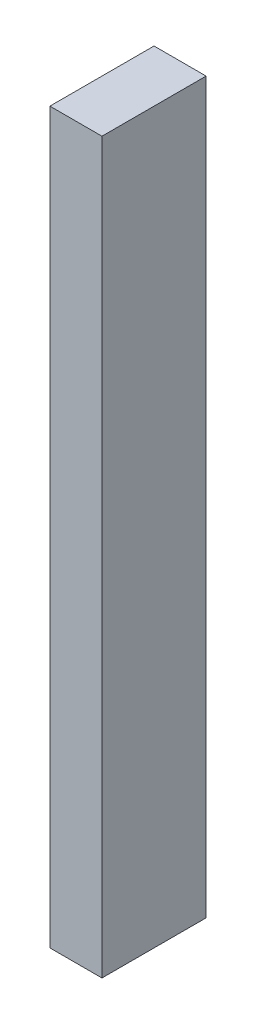
ISO-10303-21;
HEADER;
FILE_DESCRIPTION(('STEP AP214'),'2;1');
FILE_NAME('part.step','',(''),(''),'','','');
FILE_SCHEMA(('AUTOMOTIVE_DESIGN { 1 0 10303 214 1 1 1 1 }'));
ENDSEC;
DATA;
#1=APPLICATION_CONTEXT('core data for automotive mechanical design processes');
#2=APPLICATION_PROTOCOL_DEFINITION('international standard','automotive_design',2000,#1);
#3=PRODUCT_CONTEXT('',#1,'mechanical');
#4=PRODUCT('Part','Part','',(#3));
#5=PRODUCT_RELATED_PRODUCT_CATEGORY('part','',(#4));
#6=PRODUCT_DEFINITION_FORMATION('','',#4);
#7=PRODUCT_DEFINITION_CONTEXT('part definition',#1,'design');
#8=PRODUCT_DEFINITION('design','',#6,#7);
#9=PRODUCT_DEFINITION_SHAPE('','',#8);
#10=(LENGTH_UNIT() NAMED_UNIT(*) SI_UNIT(.MILLI.,.METRE.));
#11=(NAMED_UNIT(*) PLANE_ANGLE_UNIT() SI_UNIT($,.RADIAN.));
#12=(NAMED_UNIT(*) SI_UNIT($,.STERADIAN.) SOLID_ANGLE_UNIT());
#13=UNCERTAINTY_MEASURE_WITH_UNIT(LENGTH_MEASURE(1.E-05),#10,'distance_accuracy_value','');
#14=(GEOMETRIC_REPRESENTATION_CONTEXT(3) GLOBAL_UNCERTAINTY_ASSIGNED_CONTEXT((#13)) GLOBAL_UNIT_ASSIGNED_CONTEXT((#10,
#11,#12)) REPRESENTATION_CONTEXT('',''));
#15=CARTESIAN_POINT('',(0.,0.,0.));
#16=DIRECTION('',(0.,0.,1.));
#17=DIRECTION('',(1.,0.,0.));
#18=AXIS2_PLACEMENT_3D('',#15,#16,#17);
#19=CARTESIAN_POINT('',(-273.05,133.35,38.1));
#20=DIRECTION('',(1.,0.,0.));
#21=DIRECTION('',(0.,1.,0.));
#22=AXIS2_PLACEMENT_3D('',#19,#20,#21);
#23=PLANE('',#22);
#24=DIRECTION('',(0.,-1.,0.));
#25=VECTOR('',#24,1.);
#26=CARTESIAN_POINT('',(-273.05,133.35,0.));
#27=LINE('',#26,#25);
#28=CARTESIAN_POINT('',(-273.05,133.35,0.));
#29=VERTEX_POINT('',#28);
#30=CARTESIAN_POINT('',(-273.05,-133.35,0.));
#31=VERTEX_POINT('',#30);
#32=EDGE_CURVE('E102',#29,#31,#27,.T.);
#33=ORIENTED_EDGE('',*,*,#32,.T.);
#34=DIRECTION('',(0.,0.,-1.));
#35=VECTOR('',#34,1.);
#36=CARTESIAN_POINT('',(-273.05,-133.35,38.1));
#37=LINE('',#36,#35);
#38=CARTESIAN_POINT('',(-273.05,-133.35,38.1));
#39=VERTEX_POINT('',#38);
#40=EDGE_CURVE('E11',#39,#31,#37,.T.);
#41=ORIENTED_EDGE('',*,*,#40,.F.);
#42=DIRECTION('',(0.,-1.,0.));
#43=VECTOR('',#42,1.);
#44=CARTESIAN_POINT('',(-273.05,133.35,38.1));
#45=LINE('',#44,#43);
#46=CARTESIAN_POINT('',(-273.05,133.35,38.1));
#47=VERTEX_POINT('',#46);
#48=EDGE_CURVE('E90',#47,#39,#45,.T.);
#49=ORIENTED_EDGE('',*,*,#48,.F.);
#50=DIRECTION('',(0.,0.,-1.));
#51=VECTOR('',#50,1.);
#52=CARTESIAN_POINT('',(-273.05,133.35,38.1));
#53=LINE('',#52,#51);
#54=EDGE_CURVE('E98',#47,#29,#53,.T.);
#55=ORIENTED_EDGE('',*,*,#54,.T.);
#56=EDGE_LOOP('',(#33,#41,#49,#55));
#57=FACE_BOUND('',#56,.T.);
#58=ADVANCED_FACE('F39',(#57),#23,.F.);
#59=CARTESIAN_POINT('',(-273.05,-133.35,38.1));
#60=DIRECTION('',(0.,1.,0.));
#61=DIRECTION('',(0.,0.,1.));
#62=AXIS2_PLACEMENT_3D('',#59,#60,#61);
#63=PLANE('',#62);
#64=DIRECTION('',(1.,0.,0.));
#65=VECTOR('',#64,1.);
#66=CARTESIAN_POINT('',(-273.05,-133.35,0.));
#67=LINE('',#66,#65);
#68=CARTESIAN_POINT('',(-254.,-133.35,0.));
#69=VERTEX_POINT('',#68);
#70=EDGE_CURVE('E94',#31,#69,#67,.T.);
#71=ORIENTED_EDGE('',*,*,#70,.T.);
#72=DIRECTION('',(0.,0.,-1.));
#73=VECTOR('',#72,1.);
#74=CARTESIAN_POINT('',(-254.,-133.35,38.1));
#75=LINE('',#74,#73);
#76=CARTESIAN_POINT('',(-254.,-133.35,38.1));
#77=VERTEX_POINT('',#76);
#78=EDGE_CURVE('E47',#77,#69,#75,.T.);
#79=ORIENTED_EDGE('',*,*,#78,.F.);
#80=DIRECTION('',(1.,0.,0.));
#81=VECTOR('',#80,1.);
#82=CARTESIAN_POINT('',(-273.05,-133.35,38.1));
#83=LINE('',#82,#81);
#84=EDGE_CURVE('E85',#39,#77,#83,.T.);
#85=ORIENTED_EDGE('',*,*,#84,.F.);
#86=ORIENTED_EDGE('',*,*,#40,.T.);
#87=EDGE_LOOP('',(#71,#79,#85,#86));
#88=FACE_BOUND('',#87,.T.);
#89=ADVANCED_FACE('F93',(#88),#63,.F.);
#90=CARTESIAN_POINT('',(-254.,133.35,38.1));
#91=DIRECTION('',(-1.,0.,0.));
#92=DIRECTION('',(0.,0.,1.));
#93=AXIS2_PLACEMENT_3D('',#90,#91,#92);
#94=PLANE('',#93);
#95=DIRECTION('',(0.,1.,0.));
#96=VECTOR('',#95,1.);
#97=CARTESIAN_POINT('',(-254.,133.35,0.));
#98=LINE('',#97,#96);
#99=CARTESIAN_POINT('',(-254.,133.35,0.));
#100=VERTEX_POINT('',#99);
#101=EDGE_CURVE('E72',#69,#100,#98,.T.);
#102=ORIENTED_EDGE('',*,*,#101,.T.);
#103=DIRECTION('',(0.,0.,-1.));
#104=VECTOR('',#103,1.);
#105=CARTESIAN_POINT('',(-254.,133.35,38.1));
#106=LINE('',#105,#104);
#107=CARTESIAN_POINT('',(-254.,133.35,38.1));
#108=VERTEX_POINT('',#107);
#109=EDGE_CURVE('E95',#108,#100,#106,.T.);
#110=ORIENTED_EDGE('',*,*,#109,.F.);
#111=DIRECTION('',(0.,1.,0.));
#112=VECTOR('',#111,1.);
#113=CARTESIAN_POINT('',(-254.,133.35,38.1));
#114=LINE('',#113,#112);
#115=EDGE_CURVE('E88',#77,#108,#114,.T.);
#116=ORIENTED_EDGE('',*,*,#115,.F.);
#117=ORIENTED_EDGE('',*,*,#78,.T.);
#118=EDGE_LOOP('',(#102,#110,#116,#117));
#119=FACE_BOUND('',#118,.T.);
#120=ADVANCED_FACE('F96',(#119),#94,.F.);
#121=CARTESIAN_POINT('',(-273.05,133.35,38.1));
#122=DIRECTION('',(0.,-1.,0.));
#123=DIRECTION('',(0.,0.,-1.));
#124=AXIS2_PLACEMENT_3D('',#121,#122,#123);
#125=PLANE('',#124);
#126=DIRECTION('',(-1.,0.,0.));
#127=VECTOR('',#126,1.);
#128=CARTESIAN_POINT('',(-273.05,133.35,0.));
#129=LINE('',#128,#127);
#130=EDGE_CURVE('E78',#100,#29,#129,.T.);
#131=ORIENTED_EDGE('',*,*,#130,.T.);
#132=ORIENTED_EDGE('',*,*,#54,.F.);
#133=DIRECTION('',(-1.,0.,0.));
#134=VECTOR('',#133,1.);
#135=CARTESIAN_POINT('',(-273.05,133.35,38.1));
#136=LINE('',#135,#134);
#137=EDGE_CURVE('E55',#108,#47,#136,.T.);
#138=ORIENTED_EDGE('',*,*,#137,.F.);
#139=ORIENTED_EDGE('',*,*,#109,.T.);
#140=EDGE_LOOP('',(#131,#132,#138,#139));
#141=FACE_BOUND('',#140,.T.);
#142=ADVANCED_FACE('F109',(#141),#125,.F.);
#143=CARTESIAN_POINT('',(0.,0.,38.1));
#144=DIRECTION('',(0.,0.,1.));
#145=DIRECTION('',(1.,0.,0.));
#146=AXIS2_PLACEMENT_3D('',#143,#144,#145);
#147=PLANE('',#146);
#148=ORIENTED_EDGE('',*,*,#48,.T.);
#149=ORIENTED_EDGE('',*,*,#84,.T.);
#150=ORIENTED_EDGE('',*,*,#115,.T.);
#151=ORIENTED_EDGE('',*,*,#137,.T.);
#152=EDGE_LOOP('',(#148,#149,#150,#151));
#153=FACE_BOUND('',#152,.T.);
#154=ADVANCED_FACE('F86',(#153),#147,.T.);
#155=CARTESIAN_POINT('',(0.,0.,0.));
#156=DIRECTION('',(0.,0.,1.));
#157=DIRECTION('',(1.,0.,0.));
#158=AXIS2_PLACEMENT_3D('',#155,#156,#157);
#159=PLANE('',#158);
#160=ORIENTED_EDGE('',*,*,#32,.F.);
#161=ORIENTED_EDGE('',*,*,#130,.F.);
#162=ORIENTED_EDGE('',*,*,#101,.F.);
#163=ORIENTED_EDGE('',*,*,#70,.F.);
#164=EDGE_LOOP('',(#160,#161,#162,#163));
#165=FACE_BOUND('',#164,.T.);
#166=ADVANCED_FACE('F112',(#165),#159,.F.);
#167=CLOSED_SHELL('',(#58,#89,#120,#142,#154,#166));
#168=MANIFOLD_SOLID_BREP('B2',#167);
#169=ADVANCED_BREP_SHAPE_REPRESENTATION('',(#18,#168),#14);
#170=SHAPE_DEFINITION_REPRESENTATION(#9,#169);
ENDSEC;
END-ISO-10303-21;
